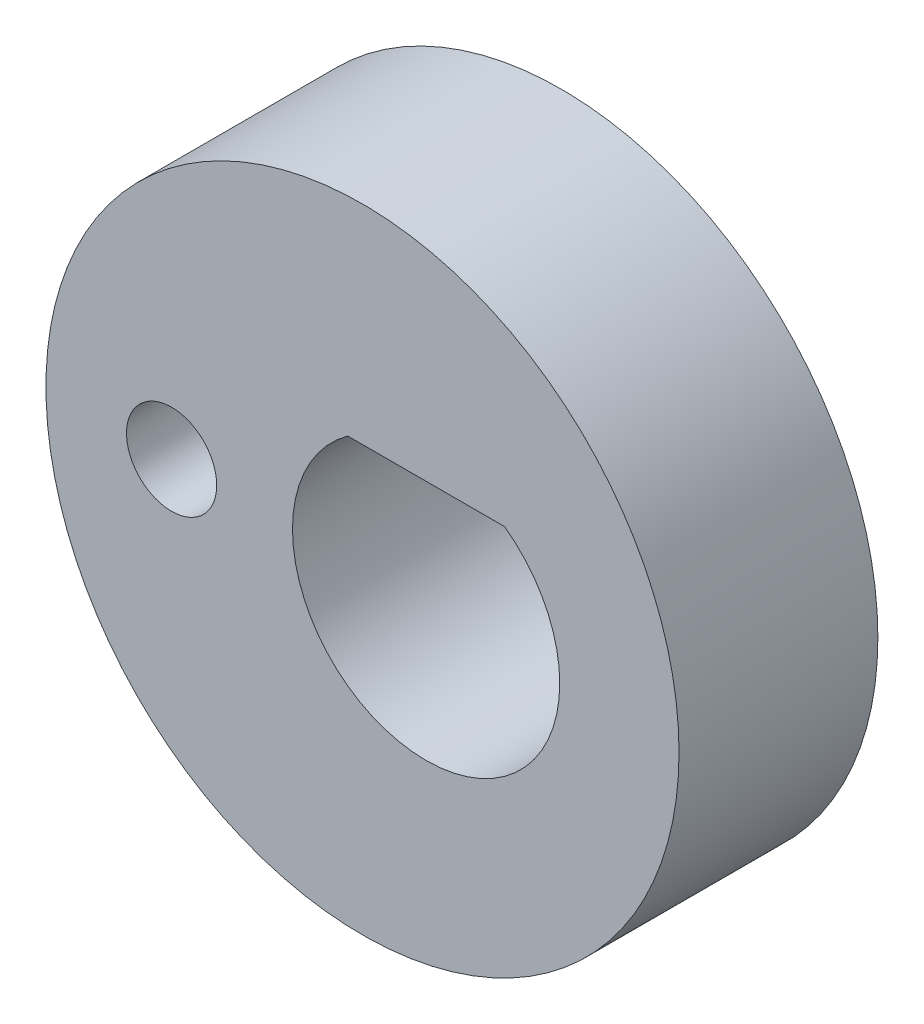
ISO-10303-21;
HEADER;
FILE_DESCRIPTION(('STEP AP214'),'2;1');
FILE_NAME('part.step','',(''),(''),'','','');
FILE_SCHEMA(('AUTOMOTIVE_DESIGN { 1 0 10303 214 1 1 1 1 }'));
ENDSEC;
DATA;
#1=APPLICATION_CONTEXT('core data for automotive mechanical design processes');
#2=APPLICATION_PROTOCOL_DEFINITION('international standard','automotive_design',2000,#1);
#3=PRODUCT_CONTEXT('',#1,'mechanical');
#4=PRODUCT('Part','Part','',(#3));
#5=PRODUCT_RELATED_PRODUCT_CATEGORY('part','',(#4));
#6=PRODUCT_DEFINITION_FORMATION('','',#4);
#7=PRODUCT_DEFINITION_CONTEXT('part definition',#1,'design');
#8=PRODUCT_DEFINITION('design','',#6,#7);
#9=PRODUCT_DEFINITION_SHAPE('','',#8);
#10=(LENGTH_UNIT() NAMED_UNIT(*) SI_UNIT(.MILLI.,.METRE.));
#11=(NAMED_UNIT(*) PLANE_ANGLE_UNIT() SI_UNIT($,.RADIAN.));
#12=(NAMED_UNIT(*) SI_UNIT($,.STERADIAN.) SOLID_ANGLE_UNIT());
#13=UNCERTAINTY_MEASURE_WITH_UNIT(LENGTH_MEASURE(1.E-05),#10,'distance_accuracy_value','');
#14=(GEOMETRIC_REPRESENTATION_CONTEXT(3) GLOBAL_UNCERTAINTY_ASSIGNED_CONTEXT((#13)) GLOBAL_UNIT_ASSIGNED_CONTEXT((#10,
#11,#12)) REPRESENTATION_CONTEXT('',''));
#15=CARTESIAN_POINT('',(0.,0.,0.));
#16=DIRECTION('',(0.,0.,1.));
#17=DIRECTION('',(1.,0.,0.));
#18=AXIS2_PLACEMENT_3D('',#15,#16,#17);
#19=CARTESIAN_POINT('',(-1.27,0.,3.96875));
#20=DIRECTION('',(0.,0.,1.));
#21=DIRECTION('',(1.,0.,0.));
#22=AXIS2_PLACEMENT_3D('',#19,#20,#21);
#23=PLANE('',#22);
#24=CARTESIAN_POINT('',(-5.08000000000048,-7.76910876073588E-13,3.96875));
#25=DIRECTION('',(0.,0.,1.));
#26=DIRECTION('',(1.,0.,0.));
#27=AXIS2_PLACEMENT_3D('',#24,#25,#26);
#28=CIRCLE('',#27,0.900000000000678);
#29=CARTESIAN_POINT('',(-4.1799999999998,-7.76910876073588E-13,3.96875));
#30=VERTEX_POINT('',#29);
#31=EDGE_CURVE('E95',#30,#30,#28,.T.);
#32=ORIENTED_EDGE('',*,*,#31,.F.);
#33=EDGE_LOOP('',(#32));
#34=FACE_BOUND('',#33,.T.);
#35=CARTESIAN_POINT('',(-1.27,0.,3.96875));
#36=DIRECTION('',(0.,0.,1.));
#37=DIRECTION('',(1.,0.,0.));
#38=AXIS2_PLACEMENT_3D('',#35,#36,#37);
#39=CIRCLE('',#38,6.31825);
#40=CARTESIAN_POINT('',(5.04825,0.,3.96875));
#41=VERTEX_POINT('',#40);
#42=EDGE_CURVE('E11',#41,#41,#39,.T.);
#43=ORIENTED_EDGE('',*,*,#42,.T.);
#44=EDGE_LOOP('',(#43));
#45=FACE_BOUND('',#44,.T.);
#46=DIRECTION('',(-1.,0.,0.));
#47=VECTOR('',#46,1.);
#48=CARTESIAN_POINT('',(-1.56576115675412,2.159,3.96875));
#49=LINE('',#48,#47);
#50=CARTESIAN_POINT('',(1.56576115675412,2.159,3.96875));
#51=VERTEX_POINT('',#50);
#52=CARTESIAN_POINT('',(-1.56576115675412,2.159,3.96875));
#53=VERTEX_POINT('',#52);
#54=EDGE_CURVE('E92',#51,#53,#49,.T.);
#55=ORIENTED_EDGE('',*,*,#54,.F.);
#56=CARTESIAN_POINT('',(0.,0.,3.96875));
#57=DIRECTION('',(0.,0.,1.));
#58=DIRECTION('',(1.,0.,0.));
#59=AXIS2_PLACEMENT_3D('',#56,#57,#58);
#60=CIRCLE('',#59,2.667);
#61=EDGE_CURVE('E79',#53,#51,#60,.T.);
#62=ORIENTED_EDGE('',*,*,#61,.F.);
#63=EDGE_LOOP('',(#55,#62));
#64=FACE_BOUND('',#63,.T.);
#65=ADVANCED_FACE('F44',(#34,#45,#64),#23,.T.);
#66=CARTESIAN_POINT('',(-1.27,0.,0.));
#67=DIRECTION('',(0.,0.,1.));
#68=DIRECTION('',(1.,0.,0.));
#69=AXIS2_PLACEMENT_3D('',#66,#67,#68);
#70=PLANE('',#69);
#71=CARTESIAN_POINT('',(-5.08000000000048,-7.76910876073588E-13,0.));
#72=DIRECTION('',(0.,0.,1.));
#73=DIRECTION('',(1.,0.,0.));
#74=AXIS2_PLACEMENT_3D('',#71,#72,#73);
#75=CIRCLE('',#74,0.900000000000678);
#76=CARTESIAN_POINT('',(-4.1799999999998,-7.76910876073588E-13,0.));
#77=VERTEX_POINT('',#76);
#78=EDGE_CURVE('E89',#77,#77,#75,.T.);
#79=ORIENTED_EDGE('',*,*,#78,.T.);
#80=EDGE_LOOP('',(#79));
#81=FACE_BOUND('',#80,.T.);
#82=CARTESIAN_POINT('',(-1.27,0.,0.));
#83=DIRECTION('',(0.,0.,1.));
#84=DIRECTION('',(1.,0.,0.));
#85=AXIS2_PLACEMENT_3D('',#82,#83,#84);
#86=CIRCLE('',#85,6.31825);
#87=CARTESIAN_POINT('',(5.04825,0.,0.));
#88=VERTEX_POINT('',#87);
#89=EDGE_CURVE('E47',#88,#88,#86,.T.);
#90=ORIENTED_EDGE('',*,*,#89,.F.);
#91=EDGE_LOOP('',(#90));
#92=FACE_BOUND('',#91,.T.);
#93=CARTESIAN_POINT('',(0.,0.,0.));
#94=DIRECTION('',(0.,0.,1.));
#95=DIRECTION('',(1.,0.,0.));
#96=AXIS2_PLACEMENT_3D('',#93,#94,#95);
#97=CIRCLE('',#96,2.667);
#98=CARTESIAN_POINT('',(-1.56576115675412,2.159,0.));
#99=VERTEX_POINT('',#98);
#100=CARTESIAN_POINT('',(1.56576115675412,2.159,0.));
#101=VERTEX_POINT('',#100);
#102=EDGE_CURVE('E69',#99,#101,#97,.T.);
#103=ORIENTED_EDGE('',*,*,#102,.T.);
#104=DIRECTION('',(-1.,0.,0.));
#105=VECTOR('',#104,1.);
#106=CARTESIAN_POINT('',(-1.56576115675412,2.159,0.));
#107=LINE('',#106,#105);
#108=EDGE_CURVE('E74',#101,#99,#107,.T.);
#109=ORIENTED_EDGE('',*,*,#108,.T.);
#110=EDGE_LOOP('',(#103,#109));
#111=FACE_BOUND('',#110,.T.);
#112=ADVANCED_FACE('F86',(#81,#92,#111),#70,.F.);
#113=CARTESIAN_POINT('',(-1.27,0.,3.96875));
#114=DIRECTION('',(0.,0.,-1.));
#115=DIRECTION('',(-1.,0.,0.));
#116=AXIS2_PLACEMENT_3D('',#113,#114,#115);
#117=CYLINDRICAL_SURFACE('',#116,6.31825);
#118=ORIENTED_EDGE('',*,*,#42,.F.);
#119=EDGE_LOOP('',(#118));
#120=FACE_BOUND('',#119,.T.);
#121=ORIENTED_EDGE('',*,*,#89,.T.);
#122=EDGE_LOOP('',(#121));
#123=FACE_BOUND('',#122,.T.);
#124=ADVANCED_FACE('F50',(#120,#123),#117,.T.);
#125=CARTESIAN_POINT('',(0.,0.,3.96875));
#126=DIRECTION('',(0.,0.,-1.));
#127=DIRECTION('',(-1.,0.,0.));
#128=AXIS2_PLACEMENT_3D('',#125,#126,#127);
#129=CYLINDRICAL_SURFACE('',#128,2.667);
#130=ORIENTED_EDGE('',*,*,#102,.F.);
#131=DIRECTION('',(0.,0.,-1.));
#132=VECTOR('',#131,1.);
#133=CARTESIAN_POINT('',(-1.56576115675412,2.159,3.96875));
#134=LINE('',#133,#132);
#135=EDGE_CURVE('E77',#53,#99,#134,.T.);
#136=ORIENTED_EDGE('',*,*,#135,.F.);
#137=ORIENTED_EDGE('',*,*,#61,.T.);
#138=DIRECTION('',(0.,0.,-1.));
#139=VECTOR('',#138,1.);
#140=CARTESIAN_POINT('',(1.56576115675412,2.159,3.96875));
#141=LINE('',#140,#139);
#142=EDGE_CURVE('E61',#51,#101,#141,.T.);
#143=ORIENTED_EDGE('',*,*,#142,.T.);
#144=EDGE_LOOP('',(#130,#136,#137,#143));
#145=FACE_BOUND('',#144,.T.);
#146=ADVANCED_FACE('F81',(#145),#129,.F.);
#147=CARTESIAN_POINT('',(-1.56576115675412,2.159,3.96875));
#148=DIRECTION('',(0.,-1.,0.));
#149=DIRECTION('',(0.,0.,-1.));
#150=AXIS2_PLACEMENT_3D('',#147,#148,#149);
#151=PLANE('',#150);
#152=ORIENTED_EDGE('',*,*,#108,.F.);
#153=ORIENTED_EDGE('',*,*,#142,.F.);
#154=ORIENTED_EDGE('',*,*,#54,.T.);
#155=ORIENTED_EDGE('',*,*,#135,.T.);
#156=EDGE_LOOP('',(#152,#153,#154,#155));
#157=FACE_BOUND('',#156,.T.);
#158=ADVANCED_FACE('F72',(#157),#151,.T.);
#159=CARTESIAN_POINT('',(-5.08000000000048,-7.76910876073588E-13,0.));
#160=DIRECTION('',(0.,0.,1.));
#161=DIRECTION('',(1.,0.,0.));
#162=AXIS2_PLACEMENT_3D('',#159,#160,#161);
#163=CYLINDRICAL_SURFACE('',#162,0.900000000000678);
#164=ORIENTED_EDGE('',*,*,#78,.F.);
#165=EDGE_LOOP('',(#164));
#166=FACE_BOUND('',#165,.T.);
#167=ORIENTED_EDGE('',*,*,#31,.T.);
#168=EDGE_LOOP('',(#167));
#169=FACE_BOUND('',#168,.T.);
#170=ADVANCED_FACE('F106',(#166,#169),#163,.F.);
#171=CLOSED_SHELL('',(#65,#112,#124,#146,#158,#170));
#172=MANIFOLD_SOLID_BREP('B2',#171);
#173=ADVANCED_BREP_SHAPE_REPRESENTATION('',(#18,#172),#14);
#174=SHAPE_DEFINITION_REPRESENTATION(#9,#173);
ENDSEC;
END-ISO-10303-21;
